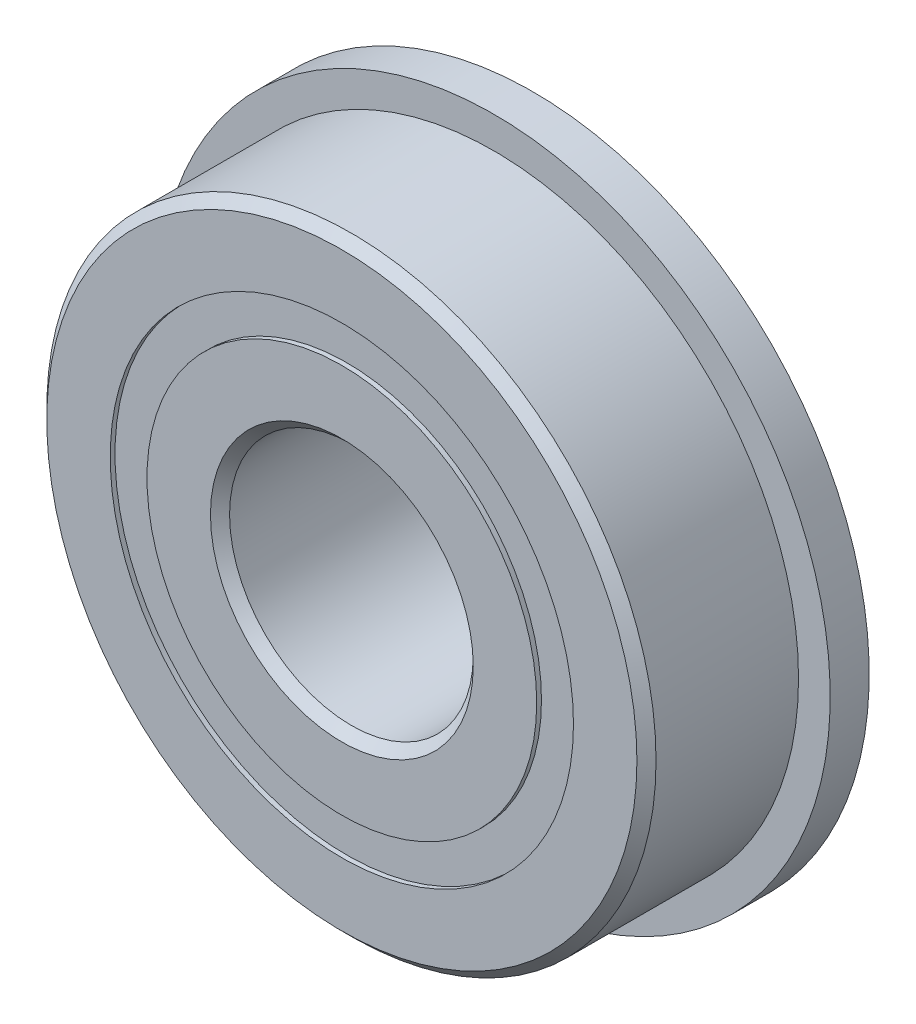
ISO-10303-21;
HEADER;
FILE_DESCRIPTION(('STEP AP214'),'2;1');
FILE_NAME('part.step','',(''),(''),'','','');
FILE_SCHEMA(('AUTOMOTIVE_DESIGN { 1 0 10303 214 1 1 1 1 }'));
ENDSEC;
DATA;
#1=APPLICATION_CONTEXT('core data for automotive mechanical design processes');
#2=APPLICATION_PROTOCOL_DEFINITION('international standard','automotive_design',2000,#1);
#3=PRODUCT_CONTEXT('',#1,'mechanical');
#4=PRODUCT('Part','Part','',(#3));
#5=PRODUCT_RELATED_PRODUCT_CATEGORY('part','',(#4));
#6=PRODUCT_DEFINITION_FORMATION('','',#4);
#7=PRODUCT_DEFINITION_CONTEXT('part definition',#1,'design');
#8=PRODUCT_DEFINITION('design','',#6,#7);
#9=PRODUCT_DEFINITION_SHAPE('','',#8);
#10=(LENGTH_UNIT() NAMED_UNIT(*) SI_UNIT(.MILLI.,.METRE.));
#11=(NAMED_UNIT(*) PLANE_ANGLE_UNIT() SI_UNIT($,.RADIAN.));
#12=(NAMED_UNIT(*) SI_UNIT($,.STERADIAN.) SOLID_ANGLE_UNIT());
#13=UNCERTAINTY_MEASURE_WITH_UNIT(LENGTH_MEASURE(1.E-05),#10,'distance_accuracy_value','');
#14=(GEOMETRIC_REPRESENTATION_CONTEXT(3) GLOBAL_UNCERTAINTY_ASSIGNED_CONTEXT((#13)) GLOBAL_UNIT_ASSIGNED_CONTEXT((#10,
#11,#12)) REPRESENTATION_CONTEXT('',''));
#15=CARTESIAN_POINT('',(0.,0.,0.));
#16=DIRECTION('',(0.,0.,1.));
#17=DIRECTION('',(1.,0.,0.));
#18=AXIS2_PLACEMENT_3D('',#15,#16,#17);
#19=CARTESIAN_POINT('',(0.,6.03522142857143,-2.36474));
#20=DIRECTION('',(0.,0.,1.));
#21=DIRECTION('',(1.,0.,0.));
#22=AXIS2_PLACEMENT_3D('',#19,#20,#21);
#23=PLANE('',#22);
#24=CARTESIAN_POINT('',(0.,0.,-2.36474));
#25=DIRECTION('',(0.,0.,1.));
#26=DIRECTION('',(1.,0.,0.));
#27=AXIS2_PLACEMENT_3D('',#24,#25,#26);
#28=CIRCLE('',#27,6.03522142857143);
#29=CARTESIAN_POINT('',(6.03522142857143,0.,-2.36474));
#30=VERTEX_POINT('',#29);
#31=EDGE_CURVE('E71',#30,#30,#28,.T.);
#32=ORIENTED_EDGE('',*,*,#31,.F.);
#33=EDGE_LOOP('',(#32));
#34=FACE_BOUND('',#33,.T.);
#35=CARTESIAN_POINT('',(0.,0.,-2.36474));
#36=DIRECTION('',(0.,0.,1.));
#37=DIRECTION('',(1.,0.,0.));
#38=AXIS2_PLACEMENT_3D('',#35,#36,#37);
#39=CIRCLE('',#38,5.07727857142857);
#40=CARTESIAN_POINT('',(5.07727857142857,0.,-2.36474));
#41=VERTEX_POINT('',#40);
#42=EDGE_CURVE('E11',#41,#41,#39,.T.);
#43=ORIENTED_EDGE('',*,*,#42,.T.);
#44=EDGE_LOOP('',(#43));
#45=FACE_BOUND('',#44,.T.);
#46=ADVANCED_FACE('F51',(#34,#45),#23,.F.);
#47=CARTESIAN_POINT('',(0.,0.,2.4892));
#48=DIRECTION('',(0.,0.,1.));
#49=DIRECTION('',(1.,0.,0.));
#50=AXIS2_PLACEMENT_3D('',#47,#48,#49);
#51=CYLINDRICAL_SURFACE('',#50,5.07727857142857);
#52=ORIENTED_EDGE('',*,*,#42,.F.);
#53=EDGE_LOOP('',(#52));
#54=FACE_BOUND('',#53,.T.);
#55=CARTESIAN_POINT('',(0.,0.,-1.20554465033679));
#56=DIRECTION('',(0.,0.,1.));
#57=DIRECTION('',(1.,0.,0.));
#58=AXIS2_PLACEMENT_3D('',#55,#56,#57);
#59=CIRCLE('',#58,5.07727857142857);
#60=CARTESIAN_POINT('',(5.07727857142857,0.,-1.20554465033679));
#61=VERTEX_POINT('',#60);
#62=EDGE_CURVE('E58',#61,#61,#59,.T.);
#63=ORIENTED_EDGE('',*,*,#62,.T.);
#64=EDGE_LOOP('',(#63));
#65=FACE_BOUND('',#64,.T.);
#66=ADVANCED_FACE('F82',(#54,#65),#51,.F.);
#67=CARTESIAN_POINT('',(0.,6.03522142857143,-1.20554465033679));
#68=DIRECTION('',(0.,0.,-1.));
#69=DIRECTION('',(-1.,0.,0.));
#70=AXIS2_PLACEMENT_3D('',#67,#68,#69);
#71=PLANE('',#70);
#72=ORIENTED_EDGE('',*,*,#62,.F.);
#73=EDGE_LOOP('',(#72));
#74=FACE_BOUND('',#73,.T.);
#75=CARTESIAN_POINT('',(0.,0.,-1.20554465033679));
#76=DIRECTION('',(0.,0.,1.));
#77=DIRECTION('',(1.,0.,0.));
#78=AXIS2_PLACEMENT_3D('',#75,#76,#77);
#79=CIRCLE('',#78,6.03522142857143);
#80=CARTESIAN_POINT('',(6.03522142857143,0.,-1.20554465033679));
#81=VERTEX_POINT('',#80);
#82=EDGE_CURVE('E65',#81,#81,#79,.T.);
#83=ORIENTED_EDGE('',*,*,#82,.T.);
#84=EDGE_LOOP('',(#83));
#85=FACE_BOUND('',#84,.T.);
#86=ADVANCED_FACE('F86',(#74,#85),#71,.F.);
#87=CARTESIAN_POINT('',(0.,0.,2.4892));
#88=DIRECTION('',(0.,0.,1.));
#89=DIRECTION('',(1.,0.,0.));
#90=AXIS2_PLACEMENT_3D('',#87,#88,#89);
#91=CYLINDRICAL_SURFACE('',#90,6.03522142857143);
#92=ORIENTED_EDGE('',*,*,#82,.F.);
#93=EDGE_LOOP('',(#92));
#94=FACE_BOUND('',#93,.T.);
#95=ORIENTED_EDGE('',*,*,#31,.T.);
#96=EDGE_LOOP('',(#95));
#97=FACE_BOUND('',#96,.T.);
#98=ADVANCED_FACE('F79',(#94,#97),#91,.T.);
#99=CLOSED_SHELL('',(#46,#66,#86,#98));
#100=MANIFOLD_SOLID_BREP('B2',#99);
#101=CARTESIAN_POINT('',(0.,6.03522142857143,2.36474));
#102=DIRECTION('',(0.,0.,-1.));
#103=DIRECTION('',(-1.,0.,0.));
#104=AXIS2_PLACEMENT_3D('',#101,#102,#103);
#105=PLANE('',#104);
#106=CARTESIAN_POINT('',(0.,0.,2.36474));
#107=DIRECTION('',(0.,0.,1.));
#108=DIRECTION('',(1.,0.,0.));
#109=AXIS2_PLACEMENT_3D('',#106,#107,#108);
#110=CIRCLE('',#109,5.07727857142857);
#111=CARTESIAN_POINT('',(5.07727857142857,0.,2.36474));
#112=VERTEX_POINT('',#111);
#113=EDGE_CURVE('E50',#112,#112,#110,.T.);
#114=ORIENTED_EDGE('',*,*,#113,.F.);
#115=EDGE_LOOP('',(#114));
#116=FACE_BOUND('',#115,.T.);
#117=CARTESIAN_POINT('',(0.,0.,2.36474));
#118=DIRECTION('',(0.,0.,1.));
#119=DIRECTION('',(1.,0.,0.));
#120=AXIS2_PLACEMENT_3D('',#117,#118,#119);
#121=CIRCLE('',#120,6.03522142857143);
#122=CARTESIAN_POINT('',(6.03522142857143,0.,2.36474));
#123=VERTEX_POINT('',#122);
#124=EDGE_CURVE('E154',#123,#123,#121,.T.);
#125=ORIENTED_EDGE('',*,*,#124,.T.);
#126=EDGE_LOOP('',(#125));
#127=FACE_BOUND('',#126,.T.);
#128=ADVANCED_FACE('F135',(#116,#127),#105,.F.);
#129=CARTESIAN_POINT('',(0.,0.,2.4892));
#130=DIRECTION('',(0.,0.,1.));
#131=DIRECTION('',(1.,0.,0.));
#132=AXIS2_PLACEMENT_3D('',#129,#130,#131);
#133=CYLINDRICAL_SURFACE('',#132,5.07727857142857);
#134=CARTESIAN_POINT('',(0.,0.,1.20554465033679));
#135=DIRECTION('',(0.,0.,1.));
#136=DIRECTION('',(1.,0.,0.));
#137=AXIS2_PLACEMENT_3D('',#134,#135,#136);
#138=CIRCLE('',#137,5.07727857142857);
#139=CARTESIAN_POINT('',(5.07727857142857,0.,1.20554465033679));
#140=VERTEX_POINT('',#139);
#141=EDGE_CURVE('E142',#140,#140,#138,.T.);
#142=ORIENTED_EDGE('',*,*,#141,.F.);
#143=EDGE_LOOP('',(#142));
#144=FACE_BOUND('',#143,.T.);
#145=ORIENTED_EDGE('',*,*,#113,.T.);
#146=EDGE_LOOP('',(#145));
#147=FACE_BOUND('',#146,.T.);
#148=ADVANCED_FACE('F169',(#144,#147),#133,.F.);
#149=CARTESIAN_POINT('',(0.,6.03522142857143,1.20554465033679));
#150=DIRECTION('',(0.,0.,1.));
#151=DIRECTION('',(1.,0.,0.));
#152=AXIS2_PLACEMENT_3D('',#149,#150,#151);
#153=PLANE('',#152);
#154=CARTESIAN_POINT('',(0.,0.,1.20554465033679));
#155=DIRECTION('',(0.,0.,1.));
#156=DIRECTION('',(1.,0.,0.));
#157=AXIS2_PLACEMENT_3D('',#154,#155,#156);
#158=CIRCLE('',#157,6.03522142857143);
#159=CARTESIAN_POINT('',(6.03522142857143,0.,1.20554465033679));
#160=VERTEX_POINT('',#159);
#161=EDGE_CURVE('E148',#160,#160,#158,.T.);
#162=ORIENTED_EDGE('',*,*,#161,.F.);
#163=EDGE_LOOP('',(#162));
#164=FACE_BOUND('',#163,.T.);
#165=ORIENTED_EDGE('',*,*,#141,.T.);
#166=EDGE_LOOP('',(#165));
#167=FACE_BOUND('',#166,.T.);
#168=ADVANCED_FACE('F164',(#164,#167),#153,.F.);
#169=CARTESIAN_POINT('',(0.,0.,2.4892));
#170=DIRECTION('',(0.,0.,1.));
#171=DIRECTION('',(1.,0.,0.));
#172=AXIS2_PLACEMENT_3D('',#169,#170,#171);
#173=CYLINDRICAL_SURFACE('',#172,6.03522142857143);
#174=ORIENTED_EDGE('',*,*,#124,.F.);
#175=EDGE_LOOP('',(#174));
#176=FACE_BOUND('',#175,.T.);
#177=ORIENTED_EDGE('',*,*,#161,.T.);
#178=EDGE_LOOP('',(#177));
#179=FACE_BOUND('',#178,.T.);
#180=ADVANCED_FACE('F161',(#176,#179),#173,.T.);
#181=CLOSED_SHELL('',(#128,#148,#168,#180));
#182=MANIFOLD_SOLID_BREP('B6',#181);
#183=CARTESIAN_POINT('',(-2.77812499999994,4.81185364977732,0.));
#184=DIRECTION('',(0.,0.,1.));
#185=DIRECTION('',(-0.499999999999989,0.866025403784445,0.));
#186=AXIS2_PLACEMENT_3D('',#183,#184,#185);
#187=SPHERICAL_SURFACE('',#186,1.20554465033679);
#188=CARTESIAN_POINT('',(-2.77812499999994,4.81185364977732,1.20554465033679));
#189=VERTEX_POINT('',#188);
#190=VERTEX_LOOP('',#189);
#191=FACE_BOUND('',#190,.T.);
#192=ADVANCED_FACE('F218',(#191),#187,.T.);
#193=CLOSED_SHELL('',(#192));
#194=MANIFOLD_SOLID_BREP('B45',#193);
#195=CARTESIAN_POINT('',(-4.81185364977726,2.77812500000006,0.));
#196=DIRECTION('',(0.,0.,1.));
#197=DIRECTION('',(-0.866025403784433,0.50000000000001,0.));
#198=AXIS2_PLACEMENT_3D('',#195,#196,#197);
#199=SPHERICAL_SURFACE('',#198,1.20554465033679);
#200=CARTESIAN_POINT('',(-4.81185364977726,2.77812500000006,1.20554465033679));
#201=VERTEX_POINT('',#200);
#202=VERTEX_LOOP('',#201);
#203=FACE_BOUND('',#202,.T.);
#204=ADVANCED_FACE('F243',(#203),#199,.T.);
#205=CLOSED_SHELL('',(#204));
#206=MANIFOLD_SOLID_BREP('B131',#205);
#207=CARTESIAN_POINT('',(-5.55625,0.,0.));
#208=DIRECTION('',(0.,0.,1.));
#209=DIRECTION('',(-1.,0.,0.));
#210=AXIS2_PLACEMENT_3D('',#207,#208,#209);
#211=SPHERICAL_SURFACE('',#210,1.20554465033679);
#212=CARTESIAN_POINT('',(-5.55625,0.,1.20554465033679));
#213=VERTEX_POINT('',#212);
#214=VERTEX_LOOP('',#213);
#215=FACE_BOUND('',#214,.T.);
#216=ADVANCED_FACE('F267',(#215),#211,.T.);
#217=CLOSED_SHELL('',(#216));
#218=MANIFOLD_SOLID_BREP('B214',#217);
#219=CARTESIAN_POINT('',(-4.81185364977731,-2.77812499999996,0.));
#220=DIRECTION('',(0.,0.,1.));
#221=DIRECTION('',(-0.866025403784443,-0.499999999999992,0.));
#222=AXIS2_PLACEMENT_3D('',#219,#220,#221);
#223=SPHERICAL_SURFACE('',#222,1.20554465033679);
#224=CARTESIAN_POINT('',(-4.81185364977731,-2.77812499999996,1.20554465033679));
#225=VERTEX_POINT('',#224);
#226=VERTEX_LOOP('',#225);
#227=FACE_BOUND('',#226,.T.);
#228=ADVANCED_FACE('F289',(#227),#223,.T.);
#229=CLOSED_SHELL('',(#228));
#230=MANIFOLD_SOLID_BREP('B239',#229);
#231=CARTESIAN_POINT('',(-2.77812500000004,-4.81185364977727,0.));
#232=DIRECTION('',(0.,0.,1.));
#233=DIRECTION('',(-0.500000000000007,-0.866025403784435,0.));
#234=AXIS2_PLACEMENT_3D('',#231,#232,#233);
#235=SPHERICAL_SURFACE('',#234,1.20554465033679);
#236=CARTESIAN_POINT('',(-2.77812500000004,-4.81185364977727,1.20554465033679));
#237=VERTEX_POINT('',#236);
#238=VERTEX_LOOP('',#237);
#239=FACE_BOUND('',#238,.T.);
#240=ADVANCED_FACE('F314',(#239),#235,.T.);
#241=CLOSED_SHELL('',(#240));
#242=MANIFOLD_SOLID_BREP('B263',#241);
#243=CARTESIAN_POINT('',(0.,-5.55625,0.));
#244=DIRECTION('',(0.,0.,1.));
#245=DIRECTION('',(0.,-1.,0.));
#246=AXIS2_PLACEMENT_3D('',#243,#244,#245);
#247=SPHERICAL_SURFACE('',#246,1.20554465033679);
#248=CARTESIAN_POINT('',(0.,-5.55625,1.20554465033679));
#249=VERTEX_POINT('',#248);
#250=VERTEX_LOOP('',#249);
#251=FACE_BOUND('',#250,.T.);
#252=ADVANCED_FACE('F338',(#251),#247,.T.);
#253=CLOSED_SHELL('',(#252));
#254=MANIFOLD_SOLID_BREP('B285',#253);
#255=CARTESIAN_POINT('',(2.77812499999997,-4.8118536497773,0.));
#256=DIRECTION('',(0.,0.,1.));
#257=DIRECTION('',(0.499999999999995,-0.866025403784442,0.));
#258=AXIS2_PLACEMENT_3D('',#255,#256,#257);
#259=SPHERICAL_SURFACE('',#258,1.20554465033679);
#260=CARTESIAN_POINT('',(2.77812499999997,-4.8118536497773,1.20554465033679));
#261=VERTEX_POINT('',#260);
#262=VERTEX_LOOP('',#261);
#263=FACE_BOUND('',#262,.T.);
#264=ADVANCED_FACE('F359',(#263),#259,.T.);
#265=CLOSED_SHELL('',(#264));
#266=MANIFOLD_SOLID_BREP('B310',#265);
#267=CARTESIAN_POINT('',(4.81185364977728,-2.77812500000002,0.));
#268=DIRECTION('',(0.,0.,1.));
#269=DIRECTION('',(0.866025403784436,-0.500000000000004,0.));
#270=AXIS2_PLACEMENT_3D('',#267,#268,#269);
#271=SPHERICAL_SURFACE('',#270,1.20554465033679);
#272=CARTESIAN_POINT('',(4.81185364977728,-2.77812500000002,1.20554465033679));
#273=VERTEX_POINT('',#272);
#274=VERTEX_LOOP('',#273);
#275=FACE_BOUND('',#274,.T.);
#276=ADVANCED_FACE('F380',(#275),#271,.T.);
#277=CLOSED_SHELL('',(#276));
#278=MANIFOLD_SOLID_BREP('B334',#277);
#279=CARTESIAN_POINT('',(5.55625,0.,0.));
#280=DIRECTION('',(0.,0.,1.));
#281=DIRECTION('',(1.,0.,0.));
#282=AXIS2_PLACEMENT_3D('',#279,#280,#281);
#283=SPHERICAL_SURFACE('',#282,1.20554465033679);
#284=CARTESIAN_POINT('',(5.55625,0.,1.20554465033679));
#285=VERTEX_POINT('',#284);
#286=VERTEX_LOOP('',#285);
#287=FACE_BOUND('',#286,.T.);
#288=ADVANCED_FACE('F401',(#287),#283,.T.);
#289=CLOSED_SHELL('',(#288));
#290=MANIFOLD_SOLID_BREP('B355',#289);
#291=CARTESIAN_POINT('',(4.81185364977729,2.77812499999999,0.));
#292=DIRECTION('',(0.,0.,1.));
#293=DIRECTION('',(0.86602540378444,0.499999999999998,0.));
#294=AXIS2_PLACEMENT_3D('',#291,#292,#293);
#295=SPHERICAL_SURFACE('',#294,1.20554465033679);
#296=CARTESIAN_POINT('',(4.81185364977729,2.77812499999999,1.20554465033679));
#297=VERTEX_POINT('',#296);
#298=VERTEX_LOOP('',#297);
#299=FACE_BOUND('',#298,.T.);
#300=ADVANCED_FACE('F422',(#299),#295,.T.);
#301=CLOSED_SHELL('',(#300));
#302=MANIFOLD_SOLID_BREP('B376',#301);
#303=CARTESIAN_POINT('',(2.77812500000001,4.81185364977728,0.));
#304=DIRECTION('',(0.,0.,1.));
#305=DIRECTION('',(0.500000000000001,0.866025403784438,0.));
#306=AXIS2_PLACEMENT_3D('',#303,#304,#305);
#307=SPHERICAL_SURFACE('',#306,1.20554465033679);
#308=CARTESIAN_POINT('',(2.77812500000001,4.81185364977728,1.20554465033679));
#309=VERTEX_POINT('',#308);
#310=VERTEX_LOOP('',#309);
#311=FACE_BOUND('',#310,.T.);
#312=ADVANCED_FACE('F446',(#311),#307,.T.);
#313=CLOSED_SHELL('',(#312));
#314=MANIFOLD_SOLID_BREP('B397',#313);
#315=CARTESIAN_POINT('',(0.,5.55625,0.));
#316=DIRECTION('',(0.,0.,1.));
#317=DIRECTION('',(0.,1.,0.));
#318=AXIS2_PLACEMENT_3D('',#315,#316,#317);
#319=SPHERICAL_SURFACE('',#318,1.20554465033679);
#320=CARTESIAN_POINT('',(0.,5.55625,1.20554465033679));
#321=VERTEX_POINT('',#320);
#322=VERTEX_LOOP('',#321);
#323=FACE_BOUND('',#322,.T.);
#324=ADVANCED_FACE('F473',(#323),#319,.T.);
#325=CLOSED_SHELL('',(#324));
#326=MANIFOLD_SOLID_BREP('B418',#325);
#327=CARTESIAN_POINT('',(0.,5.07727857142857,2.4892));
#328=DIRECTION('',(0.,0.,-1.));
#329=DIRECTION('',(-1.,0.,0.));
#330=AXIS2_PLACEMENT_3D('',#327,#328,#329);
#331=PLANE('',#330);
#332=CARTESIAN_POINT('',(0.,0.,2.4892));
#333=DIRECTION('',(0.,0.,1.));
#334=DIRECTION('',(1.,0.,0.));
#335=AXIS2_PLACEMENT_3D('',#332,#333,#334);
#336=CIRCLE('',#335,3.42392);
#337=CARTESIAN_POINT('',(3.42392,0.,2.4892));
#338=VERTEX_POINT('',#337);
#339=EDGE_CURVE('E533',#338,#338,#336,.T.);
#340=ORIENTED_EDGE('',*,*,#339,.F.);
#341=EDGE_LOOP('',(#340));
#342=FACE_BOUND('',#341,.T.);
#343=CARTESIAN_POINT('',(0.,0.,2.4892));
#344=DIRECTION('',(0.,0.,1.));
#345=DIRECTION('',(1.,0.,0.));
#346=AXIS2_PLACEMENT_3D('',#343,#344,#345);
#347=CIRCLE('',#346,5.07727857142857);
#348=CARTESIAN_POINT('',(5.07727857142857,0.,2.4892));
#349=VERTEX_POINT('',#348);
#350=EDGE_CURVE('E472',#349,#349,#347,.T.);
#351=ORIENTED_EDGE('',*,*,#350,.T.);
#352=EDGE_LOOP('',(#351));
#353=FACE_BOUND('',#352,.T.);
#354=ADVANCED_FACE('F497',(#342,#353),#331,.F.);
#355=CARTESIAN_POINT('',(0.,0.,2.4892));
#356=DIRECTION('',(0.,0.,1.));
#357=DIRECTION('',(1.,0.,0.));
#358=AXIS2_PLACEMENT_3D('',#355,#356,#357);
#359=CYLINDRICAL_SURFACE('',#358,5.07727857142857);
#360=ORIENTED_EDGE('',*,*,#350,.F.);
#361=EDGE_LOOP('',(#360));
#362=FACE_BOUND('',#361,.T.);
#363=CARTESIAN_POINT('',(0.,0.,1.10631111111111));
#364=DIRECTION('',(0.,0.,1.));
#365=DIRECTION('',(1.,0.,0.));
#366=AXIS2_PLACEMENT_3D('',#363,#364,#365);
#367=CIRCLE('',#366,5.07727857142857);
#368=CARTESIAN_POINT('',(5.07727857142857,0.,1.10631111111111));
#369=VERTEX_POINT('',#368);
#370=EDGE_CURVE('E504',#369,#369,#367,.T.);
#371=ORIENTED_EDGE('',*,*,#370,.T.);
#372=EDGE_LOOP('',(#371));
#373=FACE_BOUND('',#372,.T.);
#374=ADVANCED_FACE('F540',(#362,#373),#359,.T.);
#375=CARTESIAN_POINT('',(0.,0.,0.));
#376=DIRECTION('',(0.,0.,1.));
#377=DIRECTION('',(1.,0.,0.));
#378=AXIS2_PLACEMENT_3D('',#375,#376,#377);
#379=TOROIDAL_SURFACE('',#378,5.55625,1.20554465033679);
#380=ORIENTED_EDGE('',*,*,#370,.F.);
#381=EDGE_LOOP('',(#380));
#382=FACE_BOUND('',#381,.T.);
#383=CARTESIAN_POINT('',(0.,0.,-1.10631111111111));
#384=DIRECTION('',(0.,0.,1.));
#385=DIRECTION('',(1.,0.,0.));
#386=AXIS2_PLACEMENT_3D('',#383,#384,#385);
#387=CIRCLE('',#386,5.07727857142857);
#388=CARTESIAN_POINT('',(5.07727857142857,0.,-1.10631111111111));
#389=VERTEX_POINT('',#388);
#390=EDGE_CURVE('E510',#389,#389,#387,.T.);
#391=ORIENTED_EDGE('',*,*,#390,.T.);
#392=EDGE_LOOP('',(#391));
#393=FACE_BOUND('',#392,.T.);
#394=ADVANCED_FACE('F544',(#382,#393),#379,.F.);
#395=CARTESIAN_POINT('',(0.,0.,2.4892));
#396=DIRECTION('',(0.,0.,1.));
#397=DIRECTION('',(1.,0.,0.));
#398=AXIS2_PLACEMENT_3D('',#395,#396,#397);
#399=CYLINDRICAL_SURFACE('',#398,5.07727857142857);
#400=ORIENTED_EDGE('',*,*,#390,.F.);
#401=EDGE_LOOP('',(#400));
#402=FACE_BOUND('',#401,.T.);
#403=CARTESIAN_POINT('',(0.,0.,-2.4892));
#404=DIRECTION('',(0.,0.,1.));
#405=DIRECTION('',(1.,0.,0.));
#406=AXIS2_PLACEMENT_3D('',#403,#404,#405);
#407=CIRCLE('',#406,5.07727857142857);
#408=CARTESIAN_POINT('',(5.07727857142857,0.,-2.4892));
#409=VERTEX_POINT('',#408);
#410=EDGE_CURVE('E517',#409,#409,#407,.T.);
#411=ORIENTED_EDGE('',*,*,#410,.T.);
#412=EDGE_LOOP('',(#411));
#413=FACE_BOUND('',#412,.T.);
#414=ADVANCED_FACE('F549',(#402,#413),#399,.T.);
#415=CARTESIAN_POINT('',(0.,3.42392,-2.4892));
#416=DIRECTION('',(0.,0.,1.));
#417=DIRECTION('',(1.,0.,0.));
#418=AXIS2_PLACEMENT_3D('',#415,#416,#417);
#419=PLANE('',#418);
#420=ORIENTED_EDGE('',*,*,#410,.F.);
#421=EDGE_LOOP('',(#420));
#422=FACE_BOUND('',#421,.T.);
#423=CARTESIAN_POINT('',(0.,0.,-2.4892));
#424=DIRECTION('',(0.,0.,1.));
#425=DIRECTION('',(1.,0.,0.));
#426=AXIS2_PLACEMENT_3D('',#423,#424,#425);
#427=CIRCLE('',#426,3.42392);
#428=CARTESIAN_POINT('',(3.42392,0.,-2.4892));
#429=VERTEX_POINT('',#428);
#430=EDGE_CURVE('E523',#429,#429,#427,.T.);
#431=ORIENTED_EDGE('',*,*,#430,.T.);
#432=EDGE_LOOP('',(#431));
#433=FACE_BOUND('',#432,.T.);
#434=ADVANCED_FACE('F555',(#422,#433),#419,.F.);
#435=CARTESIAN_POINT('',(0.,0.,-2.24028));
#436=DIRECTION('',(0.,0.,-1.));
#437=DIRECTION('',(-1.,0.,0.));
#438=AXIS2_PLACEMENT_3D('',#435,#436,#437);
#439=CONICAL_SURFACE('',#438,3.175,0.785398163397445);
#440=ORIENTED_EDGE('',*,*,#430,.F.);
#441=EDGE_LOOP('',(#440));
#442=FACE_BOUND('',#441,.T.);
#443=CARTESIAN_POINT('',(0.,0.,-2.24028));
#444=DIRECTION('',(0.,0.,1.));
#445=DIRECTION('',(1.,0.,0.));
#446=AXIS2_PLACEMENT_3D('',#443,#444,#445);
#447=CIRCLE('',#446,3.175);
#448=CARTESIAN_POINT('',(3.175,0.,-2.24028));
#449=VERTEX_POINT('',#448);
#450=EDGE_CURVE('E526',#449,#449,#447,.T.);
#451=ORIENTED_EDGE('',*,*,#450,.T.);
#452=EDGE_LOOP('',(#451));
#453=FACE_BOUND('',#452,.T.);
#454=ADVANCED_FACE('F559',(#442,#453),#439,.F.);
#455=CARTESIAN_POINT('',(0.,0.,2.4892));
#456=DIRECTION('',(0.,0.,1.));
#457=DIRECTION('',(1.,0.,0.));
#458=AXIS2_PLACEMENT_3D('',#455,#456,#457);
#459=CYLINDRICAL_SURFACE('',#458,3.175);
#460=ORIENTED_EDGE('',*,*,#450,.F.);
#461=EDGE_LOOP('',(#460));
#462=FACE_BOUND('',#461,.T.);
#463=CARTESIAN_POINT('',(0.,0.,2.24028));
#464=DIRECTION('',(0.,0.,1.));
#465=DIRECTION('',(1.,0.,0.));
#466=AXIS2_PLACEMENT_3D('',#463,#464,#465);
#467=CIRCLE('',#466,3.175);
#468=CARTESIAN_POINT('',(3.175,0.,2.24028));
#469=VERTEX_POINT('',#468);
#470=EDGE_CURVE('E529',#469,#469,#467,.T.);
#471=ORIENTED_EDGE('',*,*,#470,.T.);
#472=EDGE_LOOP('',(#471));
#473=FACE_BOUND('',#472,.T.);
#474=ADVANCED_FACE('F563',(#462,#473),#459,.F.);
#475=CARTESIAN_POINT('',(0.,0.,2.4892));
#476=DIRECTION('',(0.,0.,1.));
#477=DIRECTION('',(1.,0.,0.));
#478=AXIS2_PLACEMENT_3D('',#475,#476,#477);
#479=CONICAL_SURFACE('',#478,3.42392,0.785398163397451);
#480=ORIENTED_EDGE('',*,*,#470,.F.);
#481=EDGE_LOOP('',(#480));
#482=FACE_BOUND('',#481,.T.);
#483=ORIENTED_EDGE('',*,*,#339,.T.);
#484=EDGE_LOOP('',(#483));
#485=FACE_BOUND('',#484,.T.);
#486=ADVANCED_FACE('F537',(#482,#485),#479,.F.);
#487=CLOSED_SHELL('',(#354,#374,#394,#414,#434,#454,#474,#486));
#488=MANIFOLD_SOLID_BREP('B442',#487);
#489=CARTESIAN_POINT('',(0.,0.,2.24028));
#490=DIRECTION('',(0.,0.,-1.));
#491=DIRECTION('',(-1.,0.,0.));
#492=AXIS2_PLACEMENT_3D('',#489,#490,#491);
#493=CONICAL_SURFACE('',#492,7.9375,0.785398163397447);
#494=CARTESIAN_POINT('',(0.,0.,2.4892));
#495=DIRECTION('',(0.,0.,1.));
#496=DIRECTION('',(1.,0.,0.));
#497=AXIS2_PLACEMENT_3D('',#494,#495,#496);
#498=CIRCLE('',#497,7.68858);
#499=CARTESIAN_POINT('',(7.68858,0.,2.4892));
#500=VERTEX_POINT('',#499);
#501=EDGE_CURVE('E679',#500,#500,#498,.T.);
#502=ORIENTED_EDGE('',*,*,#501,.F.);
#503=EDGE_LOOP('',(#502));
#504=FACE_BOUND('',#503,.T.);
#505=CARTESIAN_POINT('',(0.,0.,2.24028));
#506=DIRECTION('',(0.,0.,1.));
#507=DIRECTION('',(1.,0.,0.));
#508=AXIS2_PLACEMENT_3D('',#505,#506,#507);
#509=CIRCLE('',#508,7.9375);
#510=CARTESIAN_POINT('',(7.9375,0.,2.24028));
#511=VERTEX_POINT('',#510);
#512=EDGE_CURVE('E496',#511,#511,#509,.T.);
#513=ORIENTED_EDGE('',*,*,#512,.T.);
#514=EDGE_LOOP('',(#513));
#515=FACE_BOUND('',#514,.T.);
#516=ADVANCED_FACE('F647',(#504,#515),#493,.T.);
#517=CARTESIAN_POINT('',(0.,0.,2.4892));
#518=DIRECTION('',(0.,0.,1.));
#519=DIRECTION('',(1.,0.,0.));
#520=AXIS2_PLACEMENT_3D('',#517,#518,#519);
#521=CYLINDRICAL_SURFACE('',#520,7.9375);
#522=CARTESIAN_POINT('',(0.,0.,-1.4732));
#523=DIRECTION('',(0.,0.,1.));
#524=DIRECTION('',(1.,0.,0.));
#525=AXIS2_PLACEMENT_3D('',#522,#523,#524);
#526=CIRCLE('',#525,7.9375);
#527=CARTESIAN_POINT('',(7.9375,0.,-1.4732));
#528=VERTEX_POINT('',#527);
#529=EDGE_CURVE('E682',#528,#528,#526,.T.);
#530=ORIENTED_EDGE('',*,*,#529,.T.);
#531=EDGE_LOOP('',(#530));
#532=FACE_BOUND('',#531,.T.);
#533=ORIENTED_EDGE('',*,*,#512,.F.);
#534=EDGE_LOOP('',(#533));
#535=FACE_BOUND('',#534,.T.);
#536=ADVANCED_FACE('F705',(#532,#535),#521,.T.);
#537=CARTESIAN_POINT('',(0.,7.68858,-2.4892));
#538=DIRECTION('',(0.,0.,1.));
#539=DIRECTION('',(1.,0.,0.));
#540=AXIS2_PLACEMENT_3D('',#537,#538,#539);
#541=PLANE('',#540);
#542=CARTESIAN_POINT('',(0.,0.,-2.4892));
#543=DIRECTION('',(0.,0.,1.));
#544=DIRECTION('',(1.,0.,0.));
#545=AXIS2_PLACEMENT_3D('',#542,#543,#544);
#546=CIRCLE('',#545,6.03522142857143);
#547=CARTESIAN_POINT('',(6.03522142857143,0.,-2.4892));
#548=VERTEX_POINT('',#547);
#549=EDGE_CURVE('E654',#548,#548,#546,.T.);
#550=ORIENTED_EDGE('',*,*,#549,.T.);
#551=EDGE_LOOP('',(#550));
#552=FACE_BOUND('',#551,.T.);
#553=CARTESIAN_POINT('',(0.,0.,-2.4892));
#554=DIRECTION('',(0.,0.,-1.));
#555=DIRECTION('',(-1.,0.,0.));
#556=AXIS2_PLACEMENT_3D('',#553,#554,#555);
#557=CIRCLE('',#556,8.763);
#558=CARTESIAN_POINT('',(-8.763,0.,-2.4892));
#559=VERTEX_POINT('',#558);
#560=EDGE_CURVE('E685',#559,#559,#557,.T.);
#561=ORIENTED_EDGE('',*,*,#560,.T.);
#562=EDGE_LOOP('',(#561));
#563=FACE_BOUND('',#562,.T.);
#564=ADVANCED_FACE('F708',(#552,#563),#541,.F.);
#565=CARTESIAN_POINT('',(0.,0.,2.4892));
#566=DIRECTION('',(0.,0.,1.));
#567=DIRECTION('',(1.,0.,0.));
#568=AXIS2_PLACEMENT_3D('',#565,#566,#567);
#569=CYLINDRICAL_SURFACE('',#568,6.03522142857143);
#570=CARTESIAN_POINT('',(0.,0.,-1.10631111111111));
#571=DIRECTION('',(0.,0.,1.));
#572=DIRECTION('',(1.,0.,0.));
#573=AXIS2_PLACEMENT_3D('',#570,#571,#572);
#574=CIRCLE('',#573,6.03522142857143);
#575=CARTESIAN_POINT('',(6.03522142857143,0.,-1.10631111111111));
#576=VERTEX_POINT('',#575);
#577=EDGE_CURVE('E661',#576,#576,#574,.T.);
#578=ORIENTED_EDGE('',*,*,#577,.T.);
#579=EDGE_LOOP('',(#578));
#580=FACE_BOUND('',#579,.T.);
#581=ORIENTED_EDGE('',*,*,#549,.F.);
#582=EDGE_LOOP('',(#581));
#583=FACE_BOUND('',#582,.T.);
#584=ADVANCED_FACE('F713',(#580,#583),#569,.F.);
#585=CARTESIAN_POINT('',(0.,0.,0.));
#586=DIRECTION('',(0.,0.,1.));
#587=DIRECTION('',(1.,0.,0.));
#588=AXIS2_PLACEMENT_3D('',#585,#586,#587);
#589=TOROIDAL_SURFACE('',#588,5.55625,1.20554465033679);
#590=ORIENTED_EDGE('',*,*,#577,.F.);
#591=EDGE_LOOP('',(#590));
#592=FACE_BOUND('',#591,.T.);
#593=CARTESIAN_POINT('',(0.,0.,1.10631111111111));
#594=DIRECTION('',(0.,0.,1.));
#595=DIRECTION('',(1.,0.,0.));
#596=AXIS2_PLACEMENT_3D('',#593,#594,#595);
#597=CIRCLE('',#596,6.03522142857143);
#598=CARTESIAN_POINT('',(6.03522142857143,0.,1.10631111111111));
#599=VERTEX_POINT('',#598);
#600=EDGE_CURVE('E669',#599,#599,#597,.T.);
#601=ORIENTED_EDGE('',*,*,#600,.T.);
#602=EDGE_LOOP('',(#601));
#603=FACE_BOUND('',#602,.T.);
#604=ADVANCED_FACE('F719',(#592,#603),#589,.F.);
#605=CARTESIAN_POINT('',(0.,0.,2.4892));
#606=DIRECTION('',(0.,0.,1.));
#607=DIRECTION('',(1.,0.,0.));
#608=AXIS2_PLACEMENT_3D('',#605,#606,#607);
#609=CYLINDRICAL_SURFACE('',#608,6.03522142857143);
#610=ORIENTED_EDGE('',*,*,#600,.F.);
#611=EDGE_LOOP('',(#610));
#612=FACE_BOUND('',#611,.T.);
#613=CARTESIAN_POINT('',(0.,0.,2.4892));
#614=DIRECTION('',(0.,0.,1.));
#615=DIRECTION('',(1.,0.,0.));
#616=AXIS2_PLACEMENT_3D('',#613,#614,#615);
#617=CIRCLE('',#616,6.03522142857143);
#618=CARTESIAN_POINT('',(6.03522142857143,0.,2.4892));
#619=VERTEX_POINT('',#618);
#620=EDGE_CURVE('E675',#619,#619,#617,.T.);
#621=ORIENTED_EDGE('',*,*,#620,.T.);
#622=EDGE_LOOP('',(#621));
#623=FACE_BOUND('',#622,.T.);
#624=ADVANCED_FACE('F723',(#612,#623),#609,.F.);
#625=CARTESIAN_POINT('',(0.,7.68858,2.4892));
#626=DIRECTION('',(0.,0.,-1.));
#627=DIRECTION('',(-1.,0.,0.));
#628=AXIS2_PLACEMENT_3D('',#625,#626,#627);
#629=PLANE('',#628);
#630=ORIENTED_EDGE('',*,*,#620,.F.);
#631=EDGE_LOOP('',(#630));
#632=FACE_BOUND('',#631,.T.);
#633=ORIENTED_EDGE('',*,*,#501,.T.);
#634=EDGE_LOOP('',(#633));
#635=FACE_BOUND('',#634,.T.);
#636=ADVANCED_FACE('F701',(#632,#635),#629,.F.);
#637=CARTESIAN_POINT('',(0.,6.03522142857143,-1.4732));
#638=DIRECTION('',(0.,0.,1.));
#639=DIRECTION('',(1.,0.,0.));
#640=AXIS2_PLACEMENT_3D('',#637,#638,#639);
#641=PLANE('',#640);
#642=CARTESIAN_POINT('',(0.,0.,-1.4732));
#643=DIRECTION('',(0.,0.,-1.));
#644=DIRECTION('',(-1.,0.,0.));
#645=AXIS2_PLACEMENT_3D('',#642,#643,#644);
#646=CIRCLE('',#645,8.763);
#647=CARTESIAN_POINT('',(-8.763,0.,-1.4732));
#648=VERTEX_POINT('',#647);
#649=EDGE_CURVE('E689',#648,#648,#646,.T.);
#650=ORIENTED_EDGE('',*,*,#649,.F.);
#651=EDGE_LOOP('',(#650));
#652=FACE_BOUND('',#651,.T.);
#653=ORIENTED_EDGE('',*,*,#529,.F.);
#654=EDGE_LOOP('',(#653));
#655=FACE_BOUND('',#654,.T.);
#656=ADVANCED_FACE('F698',(#652,#655),#641,.T.);
#657=CARTESIAN_POINT('',(0.,0.,-2.4892));
#658=DIRECTION('',(0.,0.,-1.));
#659=DIRECTION('',(-1.,0.,0.));
#660=AXIS2_PLACEMENT_3D('',#657,#658,#659);
#661=CYLINDRICAL_SURFACE('',#660,8.763);
#662=ORIENTED_EDGE('',*,*,#649,.T.);
#663=EDGE_LOOP('',(#662));
#664=FACE_BOUND('',#663,.T.);
#665=ORIENTED_EDGE('',*,*,#560,.F.);
#666=EDGE_LOOP('',(#665));
#667=FACE_BOUND('',#666,.T.);
#668=ADVANCED_FACE('F695',(#664,#667),#661,.T.);
#669=CLOSED_SHELL('',(#516,#536,#564,#584,#604,#624,#636,#656,#668));
#670=MANIFOLD_SOLID_BREP('B467',#669);
#671=ADVANCED_BREP_SHAPE_REPRESENTATION('',(#18,#100,#182,#194,#206,#218,#230,#242,#254,#266,
#278,#290,#302,#314,#326,#488,#670),#14);
#672=SHAPE_DEFINITION_REPRESENTATION(#9,#671);
ENDSEC;
END-ISO-10303-21;
